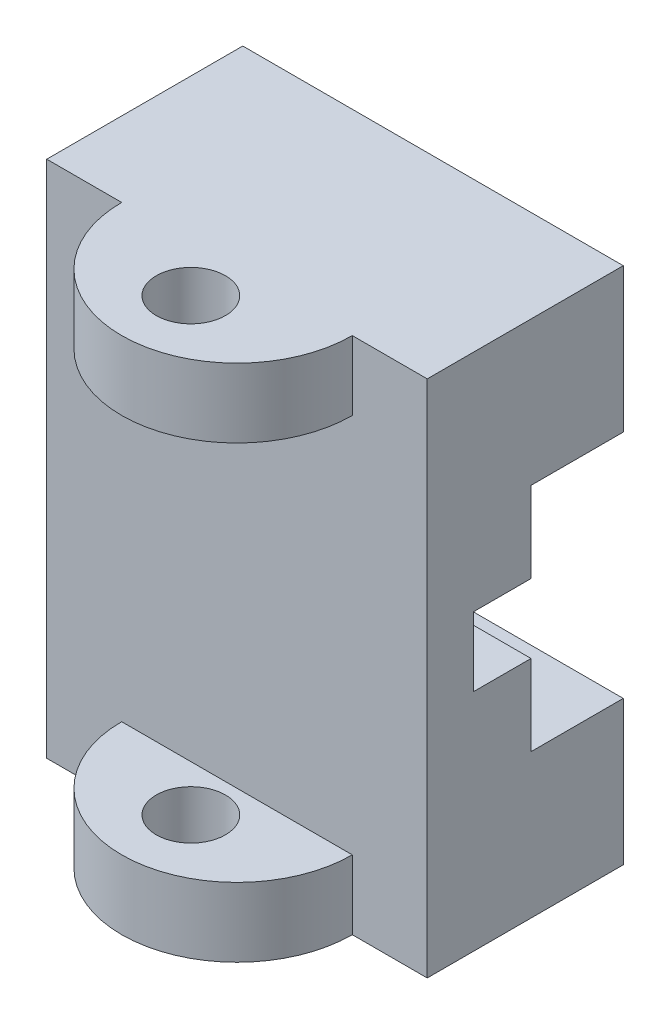
ISO-10303-21;
HEADER;
FILE_DESCRIPTION(('STEP AP214'),'2;1');
FILE_NAME('part.step','',(''),(''),'','','');
FILE_SCHEMA(('AUTOMOTIVE_DESIGN { 1 0 10303 214 1 1 1 1 }'));
ENDSEC;
DATA;
#1=APPLICATION_CONTEXT('core data for automotive mechanical design processes');
#2=APPLICATION_PROTOCOL_DEFINITION('international standard','automotive_design',2000,#1);
#3=PRODUCT_CONTEXT('',#1,'mechanical');
#4=PRODUCT('Part','Part','',(#3));
#5=PRODUCT_RELATED_PRODUCT_CATEGORY('part','',(#4));
#6=PRODUCT_DEFINITION_FORMATION('','',#4);
#7=PRODUCT_DEFINITION_CONTEXT('part definition',#1,'design');
#8=PRODUCT_DEFINITION('design','',#6,#7);
#9=PRODUCT_DEFINITION_SHAPE('','',#8);
#10=(LENGTH_UNIT() NAMED_UNIT(*) SI_UNIT(.MILLI.,.METRE.));
#11=(NAMED_UNIT(*) PLANE_ANGLE_UNIT() SI_UNIT($,.RADIAN.));
#12=(NAMED_UNIT(*) SI_UNIT($,.STERADIAN.) SOLID_ANGLE_UNIT());
#13=UNCERTAINTY_MEASURE_WITH_UNIT(LENGTH_MEASURE(1.E-05),#10,'distance_accuracy_value','');
#14=(GEOMETRIC_REPRESENTATION_CONTEXT(3) GLOBAL_UNCERTAINTY_ASSIGNED_CONTEXT((#13)) GLOBAL_UNIT_ASSIGNED_CONTEXT((#10,
#11,#12)) REPRESENTATION_CONTEXT('',''));
#15=CARTESIAN_POINT('',(0.,0.,0.));
#16=DIRECTION('',(0.,0.,1.));
#17=DIRECTION('',(1.,0.,0.));
#18=AXIS2_PLACEMENT_3D('',#15,#16,#17);
#19=CARTESIAN_POINT('',(0.,0.,17.));
#20=DIRECTION('',(0.,0.,1.));
#21=DIRECTION('',(1.,0.,0.));
#22=AXIS2_PLACEMENT_3D('',#19,#20,#21);
#23=PLANE('',#22);
#24=DIRECTION('',(-1.,0.,0.));
#25=VECTOR('',#24,1.);
#26=CARTESIAN_POINT('',(16.5,22.5,17.));
#27=LINE('',#26,#25);
#28=CARTESIAN_POINT('',(16.5,22.5,17.));
#29=VERTEX_POINT('',#28);
#30=CARTESIAN_POINT('',(10.,22.5,17.));
#31=VERTEX_POINT('',#30);
#32=EDGE_CURVE('E172',#29,#31,#27,.T.);
#33=ORIENTED_EDGE('',*,*,#32,.T.);
#34=DIRECTION('',(0.,1.,0.));
#35=VECTOR('',#34,1.);
#36=CARTESIAN_POINT('',(10.,16.5,17.));
#37=LINE('',#36,#35);
#38=CARTESIAN_POINT('',(10.,16.5,17.));
#39=VERTEX_POINT('',#38);
#40=EDGE_CURVE('E165',#39,#31,#37,.T.);
#41=ORIENTED_EDGE('',*,*,#40,.F.);
#42=DIRECTION('',(1.,0.,0.));
#43=VECTOR('',#42,1.);
#44=CARTESIAN_POINT('',(-10.,16.5,17.));
#45=LINE('',#44,#43);
#46=CARTESIAN_POINT('',(-10.,16.5,17.));
#47=VERTEX_POINT('',#46);
#48=EDGE_CURVE('E159',#47,#39,#45,.T.);
#49=ORIENTED_EDGE('',*,*,#48,.F.);
#50=DIRECTION('',(0.,1.,0.));
#51=VECTOR('',#50,1.);
#52=CARTESIAN_POINT('',(-10.,16.5,17.));
#53=LINE('',#52,#51);
#54=CARTESIAN_POINT('',(-9.99999999999999,22.5,17.));
#55=VERTEX_POINT('',#54);
#56=EDGE_CURVE('E168',#47,#55,#53,.T.);
#57=ORIENTED_EDGE('',*,*,#56,.T.);
#58=CARTESIAN_POINT('',(-16.5,22.5,17.));
#59=VERTEX_POINT('',#58);
#60=EDGE_CURVE('E254',#55,#59,#27,.T.);
#61=ORIENTED_EDGE('',*,*,#60,.T.);
#62=DIRECTION('',(0.,-1.,0.));
#63=VECTOR('',#62,1.);
#64=CARTESIAN_POINT('',(-16.5,-22.5,17.));
#65=LINE('',#64,#63);
#66=CARTESIAN_POINT('',(-16.5,-22.5,17.));
#67=VERTEX_POINT('',#66);
#68=EDGE_CURVE('E245',#59,#67,#65,.T.);
#69=ORIENTED_EDGE('',*,*,#68,.T.);
#70=DIRECTION('',(1.,0.,0.));
#71=VECTOR('',#70,1.);
#72=CARTESIAN_POINT('',(16.5,-22.5,17.));
#73=LINE('',#72,#71);
#74=CARTESIAN_POINT('',(-10.,-22.5,17.));
#75=VERTEX_POINT('',#74);
#76=EDGE_CURVE('E250',#67,#75,#73,.T.);
#77=ORIENTED_EDGE('',*,*,#76,.T.);
#78=DIRECTION('',(0.,-1.,0.));
#79=VECTOR('',#78,1.);
#80=CARTESIAN_POINT('',(-10.,-16.5,17.));
#81=LINE('',#80,#79);
#82=CARTESIAN_POINT('',(-10.,-16.5,17.));
#83=VERTEX_POINT('',#82);
#84=EDGE_CURVE('E69',#83,#75,#81,.T.);
#85=ORIENTED_EDGE('',*,*,#84,.F.);
#86=DIRECTION('',(1.,0.,0.));
#87=VECTOR('',#86,1.);
#88=CARTESIAN_POINT('',(-10.,-16.5,17.));
#89=LINE('',#88,#87);
#90=CARTESIAN_POINT('',(10.,-16.5,17.));
#91=VERTEX_POINT('',#90);
#92=EDGE_CURVE('E186',#83,#91,#89,.T.);
#93=ORIENTED_EDGE('',*,*,#92,.T.);
#94=DIRECTION('',(0.,-1.,0.));
#95=VECTOR('',#94,1.);
#96=CARTESIAN_POINT('',(10.,-16.5,17.));
#97=LINE('',#96,#95);
#98=CARTESIAN_POINT('',(10.,-22.5,17.));
#99=VERTEX_POINT('',#98);
#100=EDGE_CURVE('E190',#91,#99,#97,.T.);
#101=ORIENTED_EDGE('',*,*,#100,.T.);
#102=CARTESIAN_POINT('',(16.5,-22.5,17.));
#103=VERTEX_POINT('',#102);
#104=EDGE_CURVE('E248',#99,#103,#73,.T.);
#105=ORIENTED_EDGE('',*,*,#104,.T.);
#106=DIRECTION('',(0.,1.,0.));
#107=VECTOR('',#106,1.);
#108=CARTESIAN_POINT('',(16.5,-22.5,17.));
#109=LINE('',#108,#107);
#110=EDGE_CURVE('E252',#103,#29,#109,.T.);
#111=ORIENTED_EDGE('',*,*,#110,.T.);
#112=EDGE_LOOP('',(#33,#41,#49,#57,#61,#69,#77,#85,#93,#101,#105,#111));
#113=FACE_BOUND('',#112,.T.);
#114=ADVANCED_FACE('F46',(#113),#23,.T.);
#115=CARTESIAN_POINT('',(-16.5,-22.5,17.));
#116=DIRECTION('',(1.,0.,0.));
#117=DIRECTION('',(0.,0.,-1.));
#118=AXIS2_PLACEMENT_3D('',#115,#116,#117);
#119=PLANE('',#118);
#120=DIRECTION('',(0.,0.,-1.));
#121=VECTOR('',#120,1.);
#122=CARTESIAN_POINT('',(-16.5,-10.,0.));
#123=LINE('',#122,#121);
#124=CARTESIAN_POINT('',(-16.5,-10.,8.));
#125=VERTEX_POINT('',#124);
#126=CARTESIAN_POINT('',(-16.5,-10.,0.));
#127=VERTEX_POINT('',#126);
#128=EDGE_CURVE('E193',#125,#127,#123,.T.);
#129=ORIENTED_EDGE('',*,*,#128,.T.);
#130=DIRECTION('',(0.,-1.,0.));
#131=VECTOR('',#130,1.);
#132=CARTESIAN_POINT('',(-16.5,-22.5,0.));
#133=LINE('',#132,#131);
#134=CARTESIAN_POINT('',(-16.5,-22.5,0.));
#135=VERTEX_POINT('',#134);
#136=EDGE_CURVE('E230',#127,#135,#133,.T.);
#137=ORIENTED_EDGE('',*,*,#136,.T.);
#138=DIRECTION('',(0.,0.,-1.));
#139=VECTOR('',#138,1.);
#140=CARTESIAN_POINT('',(-16.5,-22.5,17.));
#141=LINE('',#140,#139);
#142=EDGE_CURVE('E13',#67,#135,#141,.T.);
#143=ORIENTED_EDGE('',*,*,#142,.F.);
#144=ORIENTED_EDGE('',*,*,#68,.F.);
#145=DIRECTION('',(0.,0.,-1.));
#146=VECTOR('',#145,1.);
#147=CARTESIAN_POINT('',(-16.5,22.5,17.));
#148=LINE('',#147,#146);
#149=CARTESIAN_POINT('',(-16.5,22.5,0.));
#150=VERTEX_POINT('',#149);
#151=EDGE_CURVE('E256',#59,#150,#148,.T.);
#152=ORIENTED_EDGE('',*,*,#151,.T.);
#153=CARTESIAN_POINT('',(-16.5,9.99999999999999,0.));
#154=VERTEX_POINT('',#153);
#155=EDGE_CURVE('E257',#150,#154,#133,.T.);
#156=ORIENTED_EDGE('',*,*,#155,.T.);
#157=DIRECTION('',(0.,0.,-1.));
#158=VECTOR('',#157,1.);
#159=CARTESIAN_POINT('',(-16.5,10.,0.));
#160=LINE('',#159,#158);
#161=CARTESIAN_POINT('',(-16.5,10.,8.));
#162=VERTEX_POINT('',#161);
#163=EDGE_CURVE('E198',#162,#154,#160,.T.);
#164=ORIENTED_EDGE('',*,*,#163,.F.);
#165=DIRECTION('',(0.,-1.,0.));
#166=VECTOR('',#165,1.);
#167=CARTESIAN_POINT('',(-16.5,0.,8.));
#168=LINE('',#167,#166);
#169=CARTESIAN_POINT('',(-16.5,3.00000000000001,8.));
#170=VERTEX_POINT('',#169);
#171=EDGE_CURVE('E218',#162,#170,#168,.T.);
#172=ORIENTED_EDGE('',*,*,#171,.T.);
#173=DIRECTION('',(0.,0.,-1.));
#174=VECTOR('',#173,1.);
#175=CARTESIAN_POINT('',(-16.5,3.,0.));
#176=LINE('',#175,#174);
#177=CARTESIAN_POINT('',(-16.5,3.00000000000001,13.));
#178=VERTEX_POINT('',#177);
#179=EDGE_CURVE('E224',#178,#170,#176,.T.);
#180=ORIENTED_EDGE('',*,*,#179,.F.);
#181=DIRECTION('',(0.,-1.,0.));
#182=VECTOR('',#181,1.);
#183=CARTESIAN_POINT('',(-16.5,0.,13.));
#184=LINE('',#183,#182);
#185=CARTESIAN_POINT('',(-16.5,-2.99999999999999,13.));
#186=VERTEX_POINT('',#185);
#187=EDGE_CURVE('E221',#178,#186,#184,.T.);
#188=ORIENTED_EDGE('',*,*,#187,.T.);
#189=DIRECTION('',(0.,0.,-1.));
#190=VECTOR('',#189,1.);
#191=CARTESIAN_POINT('',(-16.5,-3.,0.));
#192=LINE('',#191,#190);
#193=CARTESIAN_POINT('',(-16.5,-2.99999999999999,8.));
#194=VERTEX_POINT('',#193);
#195=EDGE_CURVE('E217',#186,#194,#192,.T.);
#196=ORIENTED_EDGE('',*,*,#195,.T.);
#197=EDGE_CURVE('E214',#194,#125,#168,.T.);
#198=ORIENTED_EDGE('',*,*,#197,.T.);
#199=EDGE_LOOP('',(#129,#137,#143,#144,#152,#156,#164,#172,#180,#188,#196,#198));
#200=FACE_BOUND('',#199,.T.);
#201=ADVANCED_FACE('F48',(#200),#119,.F.);
#202=CARTESIAN_POINT('',(16.5,-22.5,17.));
#203=DIRECTION('',(-1.,0.,0.));
#204=DIRECTION('',(0.,0.,1.));
#205=AXIS2_PLACEMENT_3D('',#202,#203,#204);
#206=PLANE('',#205);
#207=DIRECTION('',(0.,0.,-1.));
#208=VECTOR('',#207,1.);
#209=CARTESIAN_POINT('',(16.5,-10.,0.));
#210=LINE('',#209,#208);
#211=CARTESIAN_POINT('',(16.5,-10.,8.));
#212=VERTEX_POINT('',#211);
#213=CARTESIAN_POINT('',(16.5,-10.,0.));
#214=VERTEX_POINT('',#213);
#215=EDGE_CURVE('E195',#212,#214,#210,.T.);
#216=ORIENTED_EDGE('',*,*,#215,.F.);
#217=DIRECTION('',(0.,-1.,0.));
#218=VECTOR('',#217,1.);
#219=CARTESIAN_POINT('',(16.5,0.,8.));
#220=LINE('',#219,#218);
#221=CARTESIAN_POINT('',(16.5,-2.99999999999999,8.));
#222=VERTEX_POINT('',#221);
#223=EDGE_CURVE('E197',#222,#212,#220,.T.);
#224=ORIENTED_EDGE('',*,*,#223,.F.);
#225=DIRECTION('',(0.,0.,-1.));
#226=VECTOR('',#225,1.);
#227=CARTESIAN_POINT('',(16.5,-3.,0.));
#228=LINE('',#227,#226);
#229=CARTESIAN_POINT('',(16.5,-2.99999999999999,13.));
#230=VERTEX_POINT('',#229);
#231=EDGE_CURVE('E200',#230,#222,#228,.T.);
#232=ORIENTED_EDGE('',*,*,#231,.F.);
#233=DIRECTION('',(0.,-1.,0.));
#234=VECTOR('',#233,1.);
#235=CARTESIAN_POINT('',(16.5,0.,13.));
#236=LINE('',#235,#234);
#237=CARTESIAN_POINT('',(16.5,3.00000000000001,13.));
#238=VERTEX_POINT('',#237);
#239=EDGE_CURVE('E203',#238,#230,#236,.T.);
#240=ORIENTED_EDGE('',*,*,#239,.F.);
#241=DIRECTION('',(0.,0.,-1.));
#242=VECTOR('',#241,1.);
#243=CARTESIAN_POINT('',(16.5,3.,0.));
#244=LINE('',#243,#242);
#245=CARTESIAN_POINT('',(16.5,3.00000000000001,8.));
#246=VERTEX_POINT('',#245);
#247=EDGE_CURVE('E205',#238,#246,#244,.T.);
#248=ORIENTED_EDGE('',*,*,#247,.T.);
#249=CARTESIAN_POINT('',(16.5,10.,8.));
#250=VERTEX_POINT('',#249);
#251=EDGE_CURVE('E201',#250,#246,#220,.T.);
#252=ORIENTED_EDGE('',*,*,#251,.F.);
#253=DIRECTION('',(0.,0.,-1.));
#254=VECTOR('',#253,1.);
#255=CARTESIAN_POINT('',(16.5,10.,0.));
#256=LINE('',#255,#254);
#257=CARTESIAN_POINT('',(16.5,10.,0.));
#258=VERTEX_POINT('',#257);
#259=EDGE_CURVE('E208',#250,#258,#256,.T.);
#260=ORIENTED_EDGE('',*,*,#259,.T.);
#261=DIRECTION('',(0.,1.,0.));
#262=VECTOR('',#261,1.);
#263=CARTESIAN_POINT('',(16.5,-22.5,0.));
#264=LINE('',#263,#262);
#265=CARTESIAN_POINT('',(16.5,22.5,0.));
#266=VERTEX_POINT('',#265);
#267=EDGE_CURVE('E262',#258,#266,#264,.T.);
#268=ORIENTED_EDGE('',*,*,#267,.T.);
#269=DIRECTION('',(0.,0.,-1.));
#270=VECTOR('',#269,1.);
#271=CARTESIAN_POINT('',(16.5,22.5,17.));
#272=LINE('',#271,#270);
#273=EDGE_CURVE('E269',#29,#266,#272,.T.);
#274=ORIENTED_EDGE('',*,*,#273,.F.);
#275=ORIENTED_EDGE('',*,*,#110,.F.);
#276=DIRECTION('',(0.,0.,-1.));
#277=VECTOR('',#276,1.);
#278=CARTESIAN_POINT('',(16.5,-22.5,17.));
#279=LINE('',#278,#277);
#280=CARTESIAN_POINT('',(16.5,-22.5,0.));
#281=VERTEX_POINT('',#280);
#282=EDGE_CURVE('E54',#103,#281,#279,.T.);
#283=ORIENTED_EDGE('',*,*,#282,.T.);
#284=EDGE_CURVE('E263',#281,#214,#264,.T.);
#285=ORIENTED_EDGE('',*,*,#284,.T.);
#286=EDGE_LOOP('',(#216,#224,#232,#240,#248,#252,#260,#268,#274,#275,#283,#285));
#287=FACE_BOUND('',#286,.T.);
#288=ADVANCED_FACE('F277',(#287),#206,.F.);
#289=CARTESIAN_POINT('',(0.,0.,0.));
#290=DIRECTION('',(0.,0.,1.));
#291=DIRECTION('',(1.,0.,0.));
#292=AXIS2_PLACEMENT_3D('',#289,#290,#291);
#293=PLANE('',#292);
#294=DIRECTION('',(-1.,0.,0.));
#295=VECTOR('',#294,1.);
#296=CARTESIAN_POINT('',(16.5,-10.,0.));
#297=LINE('',#296,#295);
#298=EDGE_CURVE('E228',#214,#127,#297,.T.);
#299=ORIENTED_EDGE('',*,*,#298,.F.);
#300=ORIENTED_EDGE('',*,*,#284,.F.);
#301=DIRECTION('',(1.,0.,0.));
#302=VECTOR('',#301,1.);
#303=CARTESIAN_POINT('',(16.5,-22.5,0.));
#304=LINE('',#303,#302);
#305=EDGE_CURVE('E260',#135,#281,#304,.T.);
#306=ORIENTED_EDGE('',*,*,#305,.F.);
#307=ORIENTED_EDGE('',*,*,#136,.F.);
#308=EDGE_LOOP('',(#299,#300,#306,#307));
#309=FACE_BOUND('',#308,.T.);
#310=ADVANCED_FACE('F283',(#309),#293,.F.);
#311=CARTESIAN_POINT('',(16.5,-22.5,17.));
#312=DIRECTION('',(0.,1.,0.));
#313=DIRECTION('',(-1.,0.,0.));
#314=AXIS2_PLACEMENT_3D('',#311,#312,#313);
#315=PLANE('',#314);
#316=ORIENTED_EDGE('',*,*,#305,.T.);
#317=ORIENTED_EDGE('',*,*,#282,.F.);
#318=ORIENTED_EDGE('',*,*,#104,.F.);
#319=CARTESIAN_POINT('',(0.,-22.5,17.));
#320=DIRECTION('',(0.,-1.,0.));
#321=DIRECTION('',(-1.,0.,0.));
#322=AXIS2_PLACEMENT_3D('',#319,#320,#321);
#323=CIRCLE('',#322,10.);
#324=EDGE_CURVE('E181',#99,#75,#323,.T.);
#325=ORIENTED_EDGE('',*,*,#324,.T.);
#326=ORIENTED_EDGE('',*,*,#76,.F.);
#327=ORIENTED_EDGE('',*,*,#142,.T.);
#328=EDGE_LOOP('',(#316,#317,#318,#325,#326,#327));
#329=FACE_BOUND('',#328,.T.);
#330=CARTESIAN_POINT('',(0.,-22.5,21.));
#331=DIRECTION('',(0.,-1.,0.));
#332=DIRECTION('',(1.,0.,0.));
#333=AXIS2_PLACEMENT_3D('',#330,#331,#332);
#334=CIRCLE('',#333,3.);
#335=CARTESIAN_POINT('',(3.,-22.5,21.));
#336=VERTEX_POINT('',#335);
#337=EDGE_CURVE('E174',#336,#336,#334,.T.);
#338=ORIENTED_EDGE('',*,*,#337,.F.);
#339=EDGE_LOOP('',(#338));
#340=FACE_BOUND('',#339,.T.);
#341=ADVANCED_FACE('F359',(#329,#340),#315,.F.);
#342=CARTESIAN_POINT('',(16.5,22.5,17.));
#343=DIRECTION('',(0.,-1.,0.));
#344=DIRECTION('',(1.,0.,0.));
#345=AXIS2_PLACEMENT_3D('',#342,#343,#344);
#346=PLANE('',#345);
#347=DIRECTION('',(-1.,0.,0.));
#348=VECTOR('',#347,1.);
#349=CARTESIAN_POINT('',(16.5,22.5,0.));
#350=LINE('',#349,#348);
#351=EDGE_CURVE('E249',#266,#150,#350,.T.);
#352=ORIENTED_EDGE('',*,*,#351,.T.);
#353=ORIENTED_EDGE('',*,*,#151,.F.);
#354=ORIENTED_EDGE('',*,*,#60,.F.);
#355=CARTESIAN_POINT('',(0.,22.5,17.));
#356=DIRECTION('',(0.,-1.,0.));
#357=DIRECTION('',(-1.,0.,0.));
#358=AXIS2_PLACEMENT_3D('',#355,#356,#357);
#359=CIRCLE('',#358,10.);
#360=EDGE_CURVE('E61',#31,#55,#359,.T.);
#361=ORIENTED_EDGE('',*,*,#360,.F.);
#362=ORIENTED_EDGE('',*,*,#32,.F.);
#363=ORIENTED_EDGE('',*,*,#273,.T.);
#364=EDGE_LOOP('',(#352,#353,#354,#361,#362,#363));
#365=FACE_BOUND('',#364,.T.);
#366=CARTESIAN_POINT('',(0.,22.5,21.));
#367=DIRECTION('',(0.,-1.,0.));
#368=DIRECTION('',(1.,0.,0.));
#369=AXIS2_PLACEMENT_3D('',#366,#367,#368);
#370=CIRCLE('',#369,3.);
#371=CARTESIAN_POINT('',(3.,22.5,21.));
#372=VERTEX_POINT('',#371);
#373=EDGE_CURVE('E332',#372,#372,#370,.T.);
#374=ORIENTED_EDGE('',*,*,#373,.T.);
#375=EDGE_LOOP('',(#374));
#376=FACE_BOUND('',#375,.T.);
#377=ADVANCED_FACE('F328',(#365,#376),#346,.F.);
#378=ORIENTED_EDGE('',*,*,#267,.F.);
#379=DIRECTION('',(-1.,0.,0.));
#380=VECTOR('',#379,1.);
#381=CARTESIAN_POINT('',(16.5,10.,0.));
#382=LINE('',#381,#380);
#383=EDGE_CURVE('E231',#258,#154,#382,.T.);
#384=ORIENTED_EDGE('',*,*,#383,.T.);
#385=ORIENTED_EDGE('',*,*,#155,.F.);
#386=ORIENTED_EDGE('',*,*,#351,.F.);
#387=EDGE_LOOP('',(#378,#384,#385,#386));
#388=FACE_BOUND('',#387,.T.);
#389=ADVANCED_FACE('F322',(#388),#293,.F.);
#390=CARTESIAN_POINT('',(16.5,-10.,0.));
#391=DIRECTION('',(0.,1.,0.));
#392=DIRECTION('',(0.,0.,1.));
#393=AXIS2_PLACEMENT_3D('',#390,#391,#392);
#394=PLANE('',#393);
#395=ORIENTED_EDGE('',*,*,#128,.F.);
#396=DIRECTION('',(-1.,0.,0.));
#397=VECTOR('',#396,1.);
#398=CARTESIAN_POINT('',(16.5,-10.,8.));
#399=LINE('',#398,#397);
#400=EDGE_CURVE('E211',#212,#125,#399,.T.);
#401=ORIENTED_EDGE('',*,*,#400,.F.);
#402=ORIENTED_EDGE('',*,*,#215,.T.);
#403=ORIENTED_EDGE('',*,*,#298,.T.);
#404=EDGE_LOOP('',(#395,#401,#402,#403));
#405=FACE_BOUND('',#404,.T.);
#406=ADVANCED_FACE('F287',(#405),#394,.T.);
#407=CARTESIAN_POINT('',(16.5,10.,0.));
#408=DIRECTION('',(0.,1.,0.));
#409=DIRECTION('',(0.,0.,1.));
#410=AXIS2_PLACEMENT_3D('',#407,#408,#409);
#411=PLANE('',#410);
#412=ORIENTED_EDGE('',*,*,#163,.T.);
#413=ORIENTED_EDGE('',*,*,#383,.F.);
#414=ORIENTED_EDGE('',*,*,#259,.F.);
#415=DIRECTION('',(-1.,0.,0.));
#416=VECTOR('',#415,1.);
#417=CARTESIAN_POINT('',(16.5,10.,8.));
#418=LINE('',#417,#416);
#419=EDGE_CURVE('E234',#250,#162,#418,.T.);
#420=ORIENTED_EDGE('',*,*,#419,.T.);
#421=EDGE_LOOP('',(#412,#413,#414,#420));
#422=FACE_BOUND('',#421,.T.);
#423=ADVANCED_FACE('F319',(#422),#411,.F.);
#424=CARTESIAN_POINT('',(16.5,0.,8.));
#425=DIRECTION('',(0.,0.,-1.));
#426=DIRECTION('',(0.,1.,0.));
#427=AXIS2_PLACEMENT_3D('',#424,#425,#426);
#428=PLANE('',#427);
#429=ORIENTED_EDGE('',*,*,#171,.F.);
#430=ORIENTED_EDGE('',*,*,#419,.F.);
#431=ORIENTED_EDGE('',*,*,#251,.T.);
#432=DIRECTION('',(-1.,0.,0.));
#433=VECTOR('',#432,1.);
#434=CARTESIAN_POINT('',(16.5,3.00000000000001,8.));
#435=LINE('',#434,#433);
#436=EDGE_CURVE('E236',#246,#170,#435,.T.);
#437=ORIENTED_EDGE('',*,*,#436,.T.);
#438=EDGE_LOOP('',(#429,#430,#431,#437));
#439=FACE_BOUND('',#438,.T.);
#440=ADVANCED_FACE('F315',(#439),#428,.T.);
#441=CARTESIAN_POINT('',(16.5,3.,0.));
#442=DIRECTION('',(0.,1.,0.));
#443=DIRECTION('',(0.,0.,1.));
#444=AXIS2_PLACEMENT_3D('',#441,#442,#443);
#445=PLANE('',#444);
#446=ORIENTED_EDGE('',*,*,#179,.T.);
#447=ORIENTED_EDGE('',*,*,#436,.F.);
#448=ORIENTED_EDGE('',*,*,#247,.F.);
#449=DIRECTION('',(-1.,0.,0.));
#450=VECTOR('',#449,1.);
#451=CARTESIAN_POINT('',(16.5,3.00000000000001,13.));
#452=LINE('',#451,#450);
#453=EDGE_CURVE('E238',#238,#178,#452,.T.);
#454=ORIENTED_EDGE('',*,*,#453,.T.);
#455=EDGE_LOOP('',(#446,#447,#448,#454));
#456=FACE_BOUND('',#455,.T.);
#457=ADVANCED_FACE('F309',(#456),#445,.F.);
#458=CARTESIAN_POINT('',(16.5,0.,13.));
#459=DIRECTION('',(0.,0.,-1.));
#460=DIRECTION('',(0.,1.,0.));
#461=AXIS2_PLACEMENT_3D('',#458,#459,#460);
#462=PLANE('',#461);
#463=ORIENTED_EDGE('',*,*,#187,.F.);
#464=ORIENTED_EDGE('',*,*,#453,.F.);
#465=ORIENTED_EDGE('',*,*,#239,.T.);
#466=DIRECTION('',(-1.,0.,0.));
#467=VECTOR('',#466,1.);
#468=CARTESIAN_POINT('',(16.5,-2.99999999999999,13.));
#469=LINE('',#468,#467);
#470=EDGE_CURVE('E240',#230,#186,#469,.T.);
#471=ORIENTED_EDGE('',*,*,#470,.T.);
#472=EDGE_LOOP('',(#463,#464,#465,#471));
#473=FACE_BOUND('',#472,.T.);
#474=ADVANCED_FACE('F304',(#473),#462,.T.);
#475=CARTESIAN_POINT('',(16.5,-3.,0.));
#476=DIRECTION('',(0.,1.,0.));
#477=DIRECTION('',(0.,0.,1.));
#478=AXIS2_PLACEMENT_3D('',#475,#476,#477);
#479=PLANE('',#478);
#480=ORIENTED_EDGE('',*,*,#195,.F.);
#481=ORIENTED_EDGE('',*,*,#470,.F.);
#482=ORIENTED_EDGE('',*,*,#231,.T.);
#483=DIRECTION('',(-1.,0.,0.));
#484=VECTOR('',#483,1.);
#485=CARTESIAN_POINT('',(16.5,-2.99999999999999,8.));
#486=LINE('',#485,#484);
#487=EDGE_CURVE('E242',#222,#194,#486,.T.);
#488=ORIENTED_EDGE('',*,*,#487,.T.);
#489=EDGE_LOOP('',(#480,#481,#482,#488));
#490=FACE_BOUND('',#489,.T.);
#491=ADVANCED_FACE('F301',(#490),#479,.T.);
#492=ORIENTED_EDGE('',*,*,#197,.F.);
#493=ORIENTED_EDGE('',*,*,#487,.F.);
#494=ORIENTED_EDGE('',*,*,#223,.T.);
#495=ORIENTED_EDGE('',*,*,#400,.T.);
#496=EDGE_LOOP('',(#492,#493,#494,#495));
#497=FACE_BOUND('',#496,.T.);
#498=ADVANCED_FACE('F295',(#497),#428,.T.);
#499=CARTESIAN_POINT('',(0.,-16.5,17.));
#500=DIRECTION('',(0.,-1.,0.));
#501=DIRECTION('',(1.,0.,0.));
#502=AXIS2_PLACEMENT_3D('',#499,#500,#501);
#503=CYLINDRICAL_SURFACE('',#502,10.);
#504=ORIENTED_EDGE('',*,*,#324,.F.);
#505=ORIENTED_EDGE('',*,*,#100,.F.);
#506=CARTESIAN_POINT('',(0.,-16.5,17.));
#507=DIRECTION('',(0.,-1.,0.));
#508=DIRECTION('',(-1.,0.,0.));
#509=AXIS2_PLACEMENT_3D('',#506,#507,#508);
#510=CIRCLE('',#509,10.);
#511=EDGE_CURVE('E184',#91,#83,#510,.T.);
#512=ORIENTED_EDGE('',*,*,#511,.T.);
#513=ORIENTED_EDGE('',*,*,#84,.T.);
#514=EDGE_LOOP('',(#504,#505,#512,#513));
#515=FACE_BOUND('',#514,.T.);
#516=ADVANCED_FACE('F377',(#515),#503,.T.);
#517=CARTESIAN_POINT('',(0.,-16.5,17.));
#518=DIRECTION('',(0.,1.,0.));
#519=DIRECTION('',(-1.,0.,0.));
#520=AXIS2_PLACEMENT_3D('',#517,#518,#519);
#521=PLANE('',#520);
#522=CARTESIAN_POINT('',(0.,-16.5,21.));
#523=DIRECTION('',(0.,-1.,0.));
#524=DIRECTION('',(1.,0.,0.));
#525=AXIS2_PLACEMENT_3D('',#522,#523,#524);
#526=CIRCLE('',#525,3.);
#527=CARTESIAN_POINT('',(3.,-16.5,21.));
#528=VERTEX_POINT('',#527);
#529=EDGE_CURVE('E178',#528,#528,#526,.T.);
#530=ORIENTED_EDGE('',*,*,#529,.T.);
#531=EDGE_LOOP('',(#530));
#532=FACE_BOUND('',#531,.T.);
#533=ORIENTED_EDGE('',*,*,#511,.F.);
#534=ORIENTED_EDGE('',*,*,#92,.F.);
#535=EDGE_LOOP('',(#533,#534));
#536=FACE_BOUND('',#535,.T.);
#537=ADVANCED_FACE('F370',(#532,#536),#521,.T.);
#538=CARTESIAN_POINT('',(0.,-16.5,21.));
#539=DIRECTION('',(0.,-1.,0.));
#540=DIRECTION('',(1.,0.,0.));
#541=AXIS2_PLACEMENT_3D('',#538,#539,#540);
#542=CYLINDRICAL_SURFACE('',#541,3.);
#543=ORIENTED_EDGE('',*,*,#529,.F.);
#544=EDGE_LOOP('',(#543));
#545=FACE_BOUND('',#544,.T.);
#546=ORIENTED_EDGE('',*,*,#337,.T.);
#547=EDGE_LOOP('',(#546));
#548=FACE_BOUND('',#547,.T.);
#549=ADVANCED_FACE('F368',(#545,#548),#542,.F.);
#550=CARTESIAN_POINT('',(0.,16.5,17.));
#551=DIRECTION('',(0.,-1.,0.));
#552=DIRECTION('',(-1.,0.,0.));
#553=AXIS2_PLACEMENT_3D('',#550,#551,#552);
#554=PLANE('',#553);
#555=CARTESIAN_POINT('',(0.,16.5,17.));
#556=DIRECTION('',(0.,-1.,0.));
#557=DIRECTION('',(-1.,0.,0.));
#558=AXIS2_PLACEMENT_3D('',#555,#556,#557);
#559=CIRCLE('',#558,10.);
#560=EDGE_CURVE('E163',#39,#47,#559,.T.);
#561=ORIENTED_EDGE('',*,*,#560,.T.);
#562=ORIENTED_EDGE('',*,*,#48,.T.);
#563=EDGE_LOOP('',(#561,#562));
#564=FACE_BOUND('',#563,.T.);
#565=CARTESIAN_POINT('',(0.,16.5,21.));
#566=DIRECTION('',(0.,-1.,0.));
#567=DIRECTION('',(1.,0.,0.));
#568=AXIS2_PLACEMENT_3D('',#565,#566,#567);
#569=CIRCLE('',#568,3.);
#570=CARTESIAN_POINT('',(3.,16.5,21.));
#571=VERTEX_POINT('',#570);
#572=EDGE_CURVE('E330',#571,#571,#569,.T.);
#573=ORIENTED_EDGE('',*,*,#572,.F.);
#574=EDGE_LOOP('',(#573));
#575=FACE_BOUND('',#574,.T.);
#576=ADVANCED_FACE('F161',(#564,#575),#554,.T.);
#577=CARTESIAN_POINT('',(0.,16.5,17.));
#578=DIRECTION('',(0.,1.,0.));
#579=DIRECTION('',(-1.,0.,0.));
#580=AXIS2_PLACEMENT_3D('',#577,#578,#579);
#581=CYLINDRICAL_SURFACE('',#580,10.);
#582=ORIENTED_EDGE('',*,*,#360,.T.);
#583=ORIENTED_EDGE('',*,*,#56,.F.);
#584=ORIENTED_EDGE('',*,*,#560,.F.);
#585=ORIENTED_EDGE('',*,*,#40,.T.);
#586=EDGE_LOOP('',(#582,#583,#584,#585));
#587=FACE_BOUND('',#586,.T.);
#588=ADVANCED_FACE('F167',(#587),#581,.T.);
#589=CARTESIAN_POINT('',(0.,16.5,21.));
#590=DIRECTION('',(0.,1.,0.));
#591=DIRECTION('',(-1.,0.,0.));
#592=AXIS2_PLACEMENT_3D('',#589,#590,#591);
#593=CYLINDRICAL_SURFACE('',#592,3.);
#594=ORIENTED_EDGE('',*,*,#572,.T.);
#595=EDGE_LOOP('',(#594));
#596=FACE_BOUND('',#595,.T.);
#597=ORIENTED_EDGE('',*,*,#373,.F.);
#598=EDGE_LOOP('',(#597));
#599=FACE_BOUND('',#598,.T.);
#600=ADVANCED_FACE('F338',(#596,#599),#593,.F.);
#601=CLOSED_SHELL('',(#114,#201,#288,#310,#341,#377,#389,#406,#423,#440,#457,#474,#491,#498,
#516,#537,#549,#576,#588,#600));
#602=MANIFOLD_SOLID_BREP('B2',#601);
#603=ADVANCED_BREP_SHAPE_REPRESENTATION('',(#18,#602),#14);
#604=SHAPE_DEFINITION_REPRESENTATION(#9,#603);
ENDSEC;
END-ISO-10303-21;
